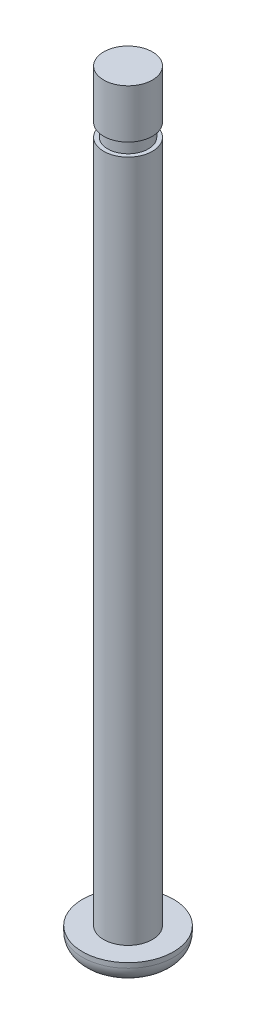
ISO-10303-21;
HEADER;
FILE_DESCRIPTION(('STEP AP214'),'2;1');
FILE_NAME('part.step','',(''),(''),'','','');
FILE_SCHEMA(('AUTOMOTIVE_DESIGN { 1 0 10303 214 1 1 1 1 }'));
ENDSEC;
DATA;
#1=APPLICATION_CONTEXT('core data for automotive mechanical design processes');
#2=APPLICATION_PROTOCOL_DEFINITION('international standard','automotive_design',2000,#1);
#3=PRODUCT_CONTEXT('',#1,'mechanical');
#4=PRODUCT('Part','Part','',(#3));
#5=PRODUCT_RELATED_PRODUCT_CATEGORY('part','',(#4));
#6=PRODUCT_DEFINITION_FORMATION('','',#4);
#7=PRODUCT_DEFINITION_CONTEXT('part definition',#1,'design');
#8=PRODUCT_DEFINITION('design','',#6,#7);
#9=PRODUCT_DEFINITION_SHAPE('','',#8);
#10=(LENGTH_UNIT() NAMED_UNIT(*) SI_UNIT(.MILLI.,.METRE.));
#11=(NAMED_UNIT(*) PLANE_ANGLE_UNIT() SI_UNIT($,.RADIAN.));
#12=(NAMED_UNIT(*) SI_UNIT($,.STERADIAN.) SOLID_ANGLE_UNIT());
#13=UNCERTAINTY_MEASURE_WITH_UNIT(LENGTH_MEASURE(1.E-05),#10,'distance_accuracy_value','');
#14=(GEOMETRIC_REPRESENTATION_CONTEXT(3) GLOBAL_UNCERTAINTY_ASSIGNED_CONTEXT((#13)) GLOBAL_UNIT_ASSIGNED_CONTEXT((#10,
#11,#12)) REPRESENTATION_CONTEXT('',''));
#15=CARTESIAN_POINT('',(0.,0.,0.));
#16=DIRECTION('',(0.,0.,1.));
#17=DIRECTION('',(1.,0.,0.));
#18=AXIS2_PLACEMENT_3D('',#15,#16,#17);
#19=CARTESIAN_POINT('',(0.,42.,0.));
#20=DIRECTION('',(0.,-1.,0.));
#21=DIRECTION('',(0.,0.,-1.));
#22=AXIS2_PLACEMENT_3D('',#19,#20,#21);
#23=CYLINDRICAL_SURFACE('',#22,1.5);
#24=CARTESIAN_POINT('',(0.,42.,0.));
#25=DIRECTION('',(0.,1.,0.));
#26=DIRECTION('',(0.,0.,1.));
#27=AXIS2_PLACEMENT_3D('',#24,#25,#26);
#28=CIRCLE('',#27,1.5);
#29=CARTESIAN_POINT('',(0.,42.,-1.5));
#30=VERTEX_POINT('',#29);
#31=EDGE_CURVE('E52',#30,#30,#28,.T.);
#32=CARTESIAN_POINT('',(0.,0.,0.));
#33=DIRECTION('',(0.,1.,0.));
#34=DIRECTION('',(0.,0.,1.));
#35=AXIS2_PLACEMENT_3D('',#32,#33,#34);
#36=CIRCLE('',#35,1.5);
#37=CARTESIAN_POINT('',(0.,0.,-1.5));
#38=VERTEX_POINT('',#37);
#39=EDGE_CURVE('E55',#38,#38,#36,.T.);
#40=CARTESIAN_POINT('',(0.,42.,-1.5));
#41=CARTESIAN_POINT('',(0.,41.5625,-1.5));
#42=CARTESIAN_POINT('',(0.,41.125,-1.5));
#43=CARTESIAN_POINT('',(0.,40.25,-1.5));
#44=CARTESIAN_POINT('',(0.,39.8125,-1.5));
#45=CARTESIAN_POINT('',(0.,38.9375,-1.5));
#46=CARTESIAN_POINT('',(0.,38.5,-1.5));
#47=CARTESIAN_POINT('',(0.,37.625,-1.5));
#48=CARTESIAN_POINT('',(0.,37.1875,-1.5));
#49=CARTESIAN_POINT('',(0.,36.3125,-1.5));
#50=CARTESIAN_POINT('',(0.,35.875,-1.5));
#51=CARTESIAN_POINT('',(0.,35.,-1.5));
#52=CARTESIAN_POINT('',(0.,34.5625,-1.5));
#53=CARTESIAN_POINT('',(0.,33.6875,-1.5));
#54=CARTESIAN_POINT('',(0.,33.25,-1.5));
#55=CARTESIAN_POINT('',(0.,32.375,-1.5));
#56=CARTESIAN_POINT('',(0.,31.9375,-1.5));
#57=CARTESIAN_POINT('',(0.,31.0625,-1.5));
#58=CARTESIAN_POINT('',(0.,30.625,-1.5));
#59=CARTESIAN_POINT('',(0.,29.75,-1.5));
#60=CARTESIAN_POINT('',(0.,29.3125,-1.5));
#61=CARTESIAN_POINT('',(0.,28.4375,-1.5));
#62=CARTESIAN_POINT('',(0.,28.,-1.5));
#63=CARTESIAN_POINT('',(0.,27.125,-1.5));
#64=CARTESIAN_POINT('',(0.,26.6875,-1.5));
#65=CARTESIAN_POINT('',(0.,25.8125,-1.5));
#66=CARTESIAN_POINT('',(0.,25.375,-1.5));
#67=CARTESIAN_POINT('',(0.,24.5,-1.5));
#68=CARTESIAN_POINT('',(0.,24.0625,-1.5));
#69=CARTESIAN_POINT('',(0.,23.1875,-1.5));
#70=CARTESIAN_POINT('',(0.,22.75,-1.5));
#71=CARTESIAN_POINT('',(0.,21.875,-1.5));
#72=CARTESIAN_POINT('',(0.,21.4375,-1.5));
#73=CARTESIAN_POINT('',(0.,20.5625,-1.5));
#74=CARTESIAN_POINT('',(0.,20.125,-1.5));
#75=CARTESIAN_POINT('',(0.,19.25,-1.5));
#76=CARTESIAN_POINT('',(0.,18.8125,-1.5));
#77=CARTESIAN_POINT('',(0.,17.9375,-1.5));
#78=CARTESIAN_POINT('',(0.,17.5,-1.5));
#79=CARTESIAN_POINT('',(0.,16.625,-1.5));
#80=CARTESIAN_POINT('',(0.,16.1875,-1.5));
#81=CARTESIAN_POINT('',(0.,15.3125,-1.5));
#82=CARTESIAN_POINT('',(0.,14.875,-1.5));
#83=CARTESIAN_POINT('',(0.,14.,-1.5));
#84=CARTESIAN_POINT('',(0.,13.5625,-1.5));
#85=CARTESIAN_POINT('',(0.,12.6875,-1.5));
#86=CARTESIAN_POINT('',(0.,12.25,-1.5));
#87=CARTESIAN_POINT('',(0.,11.375,-1.5));
#88=CARTESIAN_POINT('',(0.,10.9375,-1.5));
#89=CARTESIAN_POINT('',(0.,10.0625,-1.5));
#90=CARTESIAN_POINT('',(0.,9.625,-1.5));
#91=CARTESIAN_POINT('',(0.,8.75,-1.5));
#92=CARTESIAN_POINT('',(0.,8.3125,-1.5));
#93=CARTESIAN_POINT('',(0.,7.4375,-1.5));
#94=CARTESIAN_POINT('',(0.,7.,-1.5));
#95=CARTESIAN_POINT('',(0.,6.125,-1.5));
#96=CARTESIAN_POINT('',(0.,5.6875,-1.5));
#97=CARTESIAN_POINT('',(0.,4.8125,-1.5));
#98=CARTESIAN_POINT('',(0.,4.375,-1.5));
#99=CARTESIAN_POINT('',(0.,3.5,-1.5));
#100=CARTESIAN_POINT('',(0.,3.0625,-1.5));
#101=CARTESIAN_POINT('',(0.,2.1875,-1.5));
#102=CARTESIAN_POINT('',(0.,1.75,-1.5));
#103=CARTESIAN_POINT('',(0.,0.875000000000001,-1.5));
#104=CARTESIAN_POINT('',(0.,0.4375,-1.5));
#105=CARTESIAN_POINT('',(0.,0.,-1.5));
#106=B_SPLINE_CURVE_WITH_KNOTS('',3,(#40,#41,#42,#43,#44,#45,#46,#47,#48,#49,#50,#51,#52,#53,
#54,#55,#56,#57,#58,#59,#60,#61,#62,#63,#64,#65,#66,#67,#68,#69,#70,#71,#72,#73,#74,#75,#76,#77,
#78,#79,#80,#81,#82,#83,#84,#85,#86,#87,#88,#89,#90,#91,#92,#93,#94,#95,#96,#97,#98,#99,#100,
#101,#102,#103,#104,#105),.UNSPECIFIED.,.F.,.F.,(4,2,2,2,2,2,2,2,2,2,2,2,2,2,2,2,2,2,2,2,2,2,2,
2,2,2,2,2,2,2,2,2,4),(0.,1.31249999999999,2.625,3.9375,5.25,6.5625,7.87499999999999,
9.18749999999999,10.5,11.8125,13.125,14.4375,15.75,17.0625,18.375,19.6875,21.,22.3125,23.625,
24.9375,26.25,27.5625,28.875,30.1875,31.5,32.8125,34.125,35.4375,36.75,38.0625,39.375,40.6875,
42.),.UNSPECIFIED.);
#107=EDGE_CURVE('BSEAM37',#30,#38,#106,.T.);
#108=ORIENTED_EDGE('',*,*,#31,.F.);
#109=ORIENTED_EDGE('',*,*,#39,.T.);
#110=ORIENTED_EDGE('',*,*,#107,.T.);
#111=ORIENTED_EDGE('',*,*,#107,.F.);
#112=EDGE_LOOP('',(#108,#110,#109,#111));
#113=FACE_BOUND('',#112,.T.);
#114=ADVANCED_FACE('F37',(#113),#23,.T.);
#115=CARTESIAN_POINT('',(0.,42.,0.));
#116=DIRECTION('',(0.,1.,0.));
#117=DIRECTION('',(0.,0.,1.));
#118=AXIS2_PLACEMENT_3D('',#115,#116,#117);
#119=PLANE('',#118);
#120=CARTESIAN_POINT('',(0.,42.,0.));
#121=DIRECTION('',(0.,1.,0.));
#122=DIRECTION('',(0.,0.,1.));
#123=AXIS2_PLACEMENT_3D('',#120,#121,#122);
#124=CIRCLE('',#123,1.25);
#125=CARTESIAN_POINT('',(0.,42.,1.25));
#126=VERTEX_POINT('',#125);
#127=EDGE_CURVE('E48',#126,#126,#124,.T.);
#128=ORIENTED_EDGE('',*,*,#127,.F.);
#129=EDGE_LOOP('',(#128));
#130=FACE_BOUND('',#129,.T.);
#131=ORIENTED_EDGE('',*,*,#31,.T.);
#132=EDGE_LOOP('',(#131));
#133=FACE_BOUND('',#132,.T.);
#134=ADVANCED_FACE('F89',(#130,#133),#119,.T.);
#135=CARTESIAN_POINT('',(0.,42.8,0.));
#136=DIRECTION('',(0.,-1.,0.));
#137=DIRECTION('',(0.,0.,-1.));
#138=AXIS2_PLACEMENT_3D('',#135,#136,#137);
#139=CYLINDRICAL_SURFACE('',#138,1.25);
#140=CARTESIAN_POINT('',(0.,42.8,0.));
#141=DIRECTION('',(0.,1.,0.));
#142=DIRECTION('',(0.,0.,1.));
#143=AXIS2_PLACEMENT_3D('',#140,#141,#142);
#144=CIRCLE('',#143,1.25);
#145=CARTESIAN_POINT('',(0.,42.8,1.25));
#146=VERTEX_POINT('',#145);
#147=EDGE_CURVE('E61',#146,#146,#144,.T.);
#148=ORIENTED_EDGE('',*,*,#147,.F.);
#149=EDGE_LOOP('',(#148));
#150=FACE_BOUND('',#149,.T.);
#151=ORIENTED_EDGE('',*,*,#127,.T.);
#152=EDGE_LOOP('',(#151));
#153=FACE_BOUND('',#152,.T.);
#154=ADVANCED_FACE('F94',(#150,#153),#139,.T.);
#155=CARTESIAN_POINT('',(0.,45.8,0.));
#156=DIRECTION('',(0.,-1.,0.));
#157=DIRECTION('',(0.,0.,-1.));
#158=AXIS2_PLACEMENT_3D('',#155,#156,#157);
#159=CYLINDRICAL_SURFACE('',#158,1.5);
#160=CARTESIAN_POINT('',(0.,45.8,0.));
#161=DIRECTION('',(0.,1.,0.));
#162=DIRECTION('',(0.,0.,1.));
#163=AXIS2_PLACEMENT_3D('',#160,#161,#162);
#164=CIRCLE('',#163,1.5);
#165=CARTESIAN_POINT('',(0.,45.8,1.5));
#166=VERTEX_POINT('',#165);
#167=EDGE_CURVE('E65',#166,#166,#164,.T.);
#168=ORIENTED_EDGE('',*,*,#167,.F.);
#169=EDGE_LOOP('',(#168));
#170=FACE_BOUND('',#169,.T.);
#171=CARTESIAN_POINT('',(0.,42.8,0.));
#172=DIRECTION('',(0.,1.,0.));
#173=DIRECTION('',(0.,0.,1.));
#174=AXIS2_PLACEMENT_3D('',#171,#172,#173);
#175=CIRCLE('',#174,1.5);
#176=CARTESIAN_POINT('',(0.,42.8,1.5));
#177=VERTEX_POINT('',#176);
#178=EDGE_CURVE('E58',#177,#177,#175,.T.);
#179=ORIENTED_EDGE('',*,*,#178,.T.);
#180=EDGE_LOOP('',(#179));
#181=FACE_BOUND('',#180,.T.);
#182=ADVANCED_FACE('F102',(#170,#181),#159,.T.);
#183=CARTESIAN_POINT('',(0.,45.8,0.));
#184=DIRECTION('',(0.,1.,0.));
#185=DIRECTION('',(0.,0.,1.));
#186=AXIS2_PLACEMENT_3D('',#183,#184,#185);
#187=PLANE('',#186);
#188=ORIENTED_EDGE('',*,*,#167,.T.);
#189=EDGE_LOOP('',(#188));
#190=FACE_BOUND('',#189,.T.);
#191=ADVANCED_FACE('F106',(#190),#187,.T.);
#192=CARTESIAN_POINT('',(0.,42.8,0.));
#193=DIRECTION('',(0.,1.,0.));
#194=DIRECTION('',(0.,0.,1.));
#195=AXIS2_PLACEMENT_3D('',#192,#193,#194);
#196=PLANE('',#195);
#197=ORIENTED_EDGE('',*,*,#147,.T.);
#198=EDGE_LOOP('',(#197));
#199=FACE_BOUND('',#198,.T.);
#200=ORIENTED_EDGE('',*,*,#178,.F.);
#201=EDGE_LOOP('',(#200));
#202=FACE_BOUND('',#201,.T.);
#203=ADVANCED_FACE('F108',(#199,#202),#196,.F.);
#204=CARTESIAN_POINT('',(0.,-1.3,0.));
#205=DIRECTION('',(0.,1.,0.));
#206=DIRECTION('',(0.,0.,1.));
#207=AXIS2_PLACEMENT_3D('',#204,#205,#206);
#208=CYLINDRICAL_SURFACE('',#207,2.8);
#209=CARTESIAN_POINT('',(0.,-0.3,0.));
#210=DIRECTION('',(0.,-1.,0.));
#211=DIRECTION('',(0.,0.,-1.));
#212=AXIS2_PLACEMENT_3D('',#209,#210,#211);
#213=CIRCLE('',#212,2.8);
#214=CARTESIAN_POINT('',(0.,-0.3,-2.8));
#215=VERTEX_POINT('',#214);
#216=EDGE_CURVE('E10',#215,#215,#213,.F.);
#217=ORIENTED_EDGE('',*,*,#216,.T.);
#218=EDGE_LOOP('',(#217));
#219=FACE_BOUND('',#218,.T.);
#220=CARTESIAN_POINT('',(0.,0.,0.));
#221=DIRECTION('',(0.,-1.,0.));
#222=DIRECTION('',(0.,0.,-1.));
#223=AXIS2_PLACEMENT_3D('',#220,#221,#222);
#224=CIRCLE('',#223,2.8);
#225=CARTESIAN_POINT('',(0.,0.,-2.8));
#226=VERTEX_POINT('',#225);
#227=EDGE_CURVE('E59',#226,#226,#224,.T.);
#228=ORIENTED_EDGE('',*,*,#227,.T.);
#229=EDGE_LOOP('',(#228));
#230=FACE_BOUND('',#229,.T.);
#231=ADVANCED_FACE('F73',(#219,#230),#208,.T.);
#232=CARTESIAN_POINT('',(0.,-1.3,0.));
#233=DIRECTION('',(0.,-1.,0.));
#234=DIRECTION('',(0.,0.,-1.));
#235=AXIS2_PLACEMENT_3D('',#232,#233,#234);
#236=PLANE('',#235);
#237=CARTESIAN_POINT('',(0.,-1.3,0.));
#238=DIRECTION('',(0.,-1.,0.));
#239=DIRECTION('',(0.,0.,-1.));
#240=AXIS2_PLACEMENT_3D('',#237,#238,#239);
#241=CIRCLE('',#240,1.8);
#242=CARTESIAN_POINT('',(0.,-1.3,-1.8));
#243=VERTEX_POINT('',#242);
#244=EDGE_CURVE('E44',#243,#243,#241,.T.);
#245=ORIENTED_EDGE('',*,*,#244,.T.);
#246=EDGE_LOOP('',(#245));
#247=FACE_BOUND('',#246,.T.);
#248=ADVANCED_FACE('F77',(#247),#236,.T.);
#249=CARTESIAN_POINT('',(0.,0.,0.));
#250=DIRECTION('',(0.,-1.,0.));
#251=DIRECTION('',(0.,0.,-1.));
#252=AXIS2_PLACEMENT_3D('',#249,#250,#251);
#253=PLANE('',#252);
#254=ORIENTED_EDGE('',*,*,#39,.F.);
#255=EDGE_LOOP('',(#254));
#256=FACE_BOUND('',#255,.T.);
#257=ORIENTED_EDGE('',*,*,#227,.F.);
#258=EDGE_LOOP('',(#257));
#259=FACE_BOUND('',#258,.T.);
#260=ADVANCED_FACE('F75',(#256,#259),#253,.F.);
#261=CARTESIAN_POINT('',(0.,-0.3,0.));
#262=DIRECTION('',(0.,-1.,0.));
#263=DIRECTION('',(0.,0.,-1.));
#264=AXIS2_PLACEMENT_3D('',#261,#262,#263);
#265=TOROIDAL_SURFACE('',#264,1.8,1.);
#266=ORIENTED_EDGE('',*,*,#216,.F.);
#267=EDGE_LOOP('',(#266));
#268=FACE_BOUND('',#267,.T.);
#269=ORIENTED_EDGE('',*,*,#244,.F.);
#270=EDGE_LOOP('',(#269));
#271=FACE_BOUND('',#270,.T.);
#272=ADVANCED_FACE('F39',(#268,#271),#265,.T.);
#273=CLOSED_SHELL('',(#114,#134,#154,#182,#191,#203,#231,#248,#260,#272));
#274=MANIFOLD_SOLID_BREP('B2',#273);
#275=ADVANCED_BREP_SHAPE_REPRESENTATION('',(#18,#274),#14);
#276=SHAPE_DEFINITION_REPRESENTATION(#9,#275);
ENDSEC;
END-ISO-10303-21;
